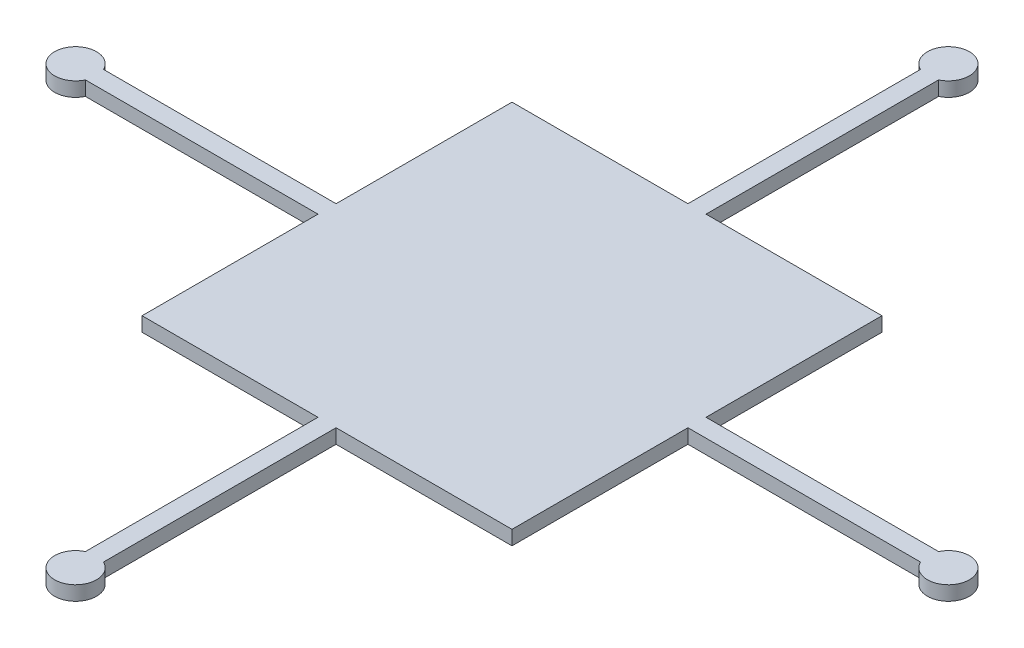
ISO-10303-21;
HEADER;
FILE_DESCRIPTION(('STEP AP214'),'2;1');
FILE_NAME('part.step','',(''),(''),'','','');
FILE_SCHEMA(('AUTOMOTIVE_DESIGN { 1 0 10303 214 1 1 1 1 }'));
ENDSEC;
DATA;
#1=APPLICATION_CONTEXT('core data for automotive mechanical design processes');
#2=APPLICATION_PROTOCOL_DEFINITION('international standard','automotive_design',2000,#1);
#3=PRODUCT_CONTEXT('',#1,'mechanical');
#4=PRODUCT('Part','Part','',(#3));
#5=PRODUCT_RELATED_PRODUCT_CATEGORY('part','',(#4));
#6=PRODUCT_DEFINITION_FORMATION('','',#4);
#7=PRODUCT_DEFINITION_CONTEXT('part definition',#1,'design');
#8=PRODUCT_DEFINITION('design','',#6,#7);
#9=PRODUCT_DEFINITION_SHAPE('','',#8);
#10=(LENGTH_UNIT() NAMED_UNIT(*) SI_UNIT(.MILLI.,.METRE.));
#11=(NAMED_UNIT(*) PLANE_ANGLE_UNIT() SI_UNIT($,.RADIAN.));
#12=(NAMED_UNIT(*) SI_UNIT($,.STERADIAN.) SOLID_ANGLE_UNIT());
#13=UNCERTAINTY_MEASURE_WITH_UNIT(LENGTH_MEASURE(1.E-05),#10,'distance_accuracy_value','');
#14=(GEOMETRIC_REPRESENTATION_CONTEXT(3) GLOBAL_UNCERTAINTY_ASSIGNED_CONTEXT((#13)) GLOBAL_UNIT_ASSIGNED_CONTEXT((#10,
#11,#12)) REPRESENTATION_CONTEXT('',''));
#15=CARTESIAN_POINT('',(0.,0.,0.));
#16=DIRECTION('',(0.,0.,1.));
#17=DIRECTION('',(1.,0.,0.));
#18=AXIS2_PLACEMENT_3D('',#15,#16,#17);
#19=CARTESIAN_POINT('',(0.,2.54,0.));
#20=DIRECTION('',(1.,0.,0.));
#21=DIRECTION('',(0.,0.,-1.));
#22=AXIS2_PLACEMENT_3D('',#19,#20,#21);
#23=PLANE('',#22);
#24=DIRECTION('',(0.,0.,1.));
#25=VECTOR('',#24,1.);
#26=CARTESIAN_POINT('',(0.,0.,0.));
#27=LINE('',#26,#25);
#28=CARTESIAN_POINT('',(0.,0.,-31.150096625763));
#29=VERTEX_POINT('',#28);
#30=CARTESIAN_POINT('',(0.,0.,0.));
#31=VERTEX_POINT('',#30);
#32=EDGE_CURVE('E201',#29,#31,#27,.T.);
#33=ORIENTED_EDGE('',*,*,#32,.T.);
#34=DIRECTION('',(0.,-1.,0.));
#35=VECTOR('',#34,1.);
#36=CARTESIAN_POINT('',(0.,2.54,0.));
#37=LINE('',#36,#35);
#38=CARTESIAN_POINT('',(0.,2.54,0.));
#39=VERTEX_POINT('',#38);
#40=EDGE_CURVE('E11',#39,#31,#37,.T.);
#41=ORIENTED_EDGE('',*,*,#40,.F.);
#42=DIRECTION('',(0.,0.,1.));
#43=VECTOR('',#42,1.);
#44=CARTESIAN_POINT('',(0.,2.54,0.));
#45=LINE('',#44,#43);
#46=CARTESIAN_POINT('',(0.,2.54,-31.150096625763));
#47=VERTEX_POINT('',#46);
#48=EDGE_CURVE('E239',#47,#39,#45,.T.);
#49=ORIENTED_EDGE('',*,*,#48,.F.);
#50=DIRECTION('',(0.,-1.,0.));
#51=VECTOR('',#50,1.);
#52=CARTESIAN_POINT('',(0.,2.54,-31.150096625763));
#53=LINE('',#52,#51);
#54=EDGE_CURVE('E197',#47,#29,#53,.T.);
#55=ORIENTED_EDGE('',*,*,#54,.T.);
#56=EDGE_LOOP('',(#33,#41,#49,#55));
#57=FACE_BOUND('',#56,.T.);
#58=ADVANCED_FACE('F33',(#57),#23,.F.);
#59=CARTESIAN_POINT('',(0.,2.54,0.));
#60=DIRECTION('',(0.,0.,-1.));
#61=DIRECTION('',(-1.,0.,0.));
#62=AXIS2_PLACEMENT_3D('',#59,#60,#61);
#63=PLANE('',#62);
#64=DIRECTION('',(1.,0.,0.));
#65=VECTOR('',#64,1.);
#66=CARTESIAN_POINT('',(0.,0.,0.));
#67=LINE('',#66,#65);
#68=CARTESIAN_POINT('',(31.150096625763,0.,0.));
#69=VERTEX_POINT('',#68);
#70=EDGE_CURVE('E204',#31,#69,#67,.T.);
#71=ORIENTED_EDGE('',*,*,#70,.T.);
#72=DIRECTION('',(0.,-1.,0.));
#73=VECTOR('',#72,1.);
#74=CARTESIAN_POINT('',(31.150096625763,2.54,0.));
#75=LINE('',#74,#73);
#76=CARTESIAN_POINT('',(31.150096625763,2.54,0.));
#77=VERTEX_POINT('',#76);
#78=EDGE_CURVE('E41',#77,#69,#75,.T.);
#79=ORIENTED_EDGE('',*,*,#78,.F.);
#80=DIRECTION('',(1.,0.,0.));
#81=VECTOR('',#80,1.);
#82=CARTESIAN_POINT('',(0.,2.54,0.));
#83=LINE('',#82,#81);
#84=EDGE_CURVE('E128',#39,#77,#83,.T.);
#85=ORIENTED_EDGE('',*,*,#84,.F.);
#86=ORIENTED_EDGE('',*,*,#40,.T.);
#87=EDGE_LOOP('',(#71,#79,#85,#86));
#88=FACE_BOUND('',#87,.T.);
#89=ADVANCED_FACE('F357',(#88),#63,.F.);
#90=CARTESIAN_POINT('',(31.150096625763,2.54,0.));
#91=DIRECTION('',(1.,0.,0.));
#92=DIRECTION('',(0.,0.,-1.));
#93=AXIS2_PLACEMENT_3D('',#90,#91,#92);
#94=PLANE('',#93);
#95=DIRECTION('',(0.,0.,1.));
#96=VECTOR('',#95,1.);
#97=CARTESIAN_POINT('',(31.150096625763,0.,0.));
#98=LINE('',#97,#96);
#99=CARTESIAN_POINT('',(31.150096625763,0.,41.1752629926275));
#100=VERTEX_POINT('',#99);
#101=EDGE_CURVE('E206',#69,#100,#98,.T.);
#102=ORIENTED_EDGE('',*,*,#101,.T.);
#103=DIRECTION('',(0.,-1.,0.));
#104=VECTOR('',#103,1.);
#105=CARTESIAN_POINT('',(31.150096625763,2.54,41.1752629926275));
#106=LINE('',#105,#104);
#107=CARTESIAN_POINT('',(31.150096625763,2.54,41.1752629926275));
#108=VERTEX_POINT('',#107);
#109=EDGE_CURVE('E282',#108,#100,#106,.T.);
#110=ORIENTED_EDGE('',*,*,#109,.F.);
#111=DIRECTION('',(0.,0.,1.));
#112=VECTOR('',#111,1.);
#113=CARTESIAN_POINT('',(31.150096625763,2.54,0.));
#114=LINE('',#113,#112);
#115=EDGE_CURVE('E290',#77,#108,#114,.T.);
#116=ORIENTED_EDGE('',*,*,#115,.F.);
#117=ORIENTED_EDGE('',*,*,#78,.T.);
#118=EDGE_LOOP('',(#102,#110,#116,#117));
#119=FACE_BOUND('',#118,.T.);
#120=ADVANCED_FACE('F288',(#119),#94,.F.);
#121=CARTESIAN_POINT('',(32.7530633605836,2.54,44.5210958705608));
#122=DIRECTION('',(0.,-1.,0.));
#123=DIRECTION('',(0.,0.,-1.));
#124=AXIS2_PLACEMENT_3D('',#121,#122,#123);
#125=CYLINDRICAL_SURFACE('',#124,3.71000000000006);
#126=CARTESIAN_POINT('',(32.7530633605836,0.,44.5210958705608));
#127=DIRECTION('',(0.,1.,0.));
#128=DIRECTION('',(0.,0.,1.));
#129=AXIS2_PLACEMENT_3D('',#126,#127,#128);
#130=CIRCLE('',#129,3.71000000000006);
#131=CARTESIAN_POINT('',(34.3560300954041,0.,41.1752629926275));
#132=VERTEX_POINT('',#131);
#133=EDGE_CURVE('E208',#100,#132,#130,.T.);
#134=ORIENTED_EDGE('',*,*,#133,.T.);
#135=DIRECTION('',(0.,-1.,0.));
#136=VECTOR('',#135,1.);
#137=CARTESIAN_POINT('',(34.3560300954041,2.54,41.1752629926275));
#138=LINE('',#137,#136);
#139=CARTESIAN_POINT('',(34.3560300954041,2.54,41.1752629926275));
#140=VERTEX_POINT('',#139);
#141=EDGE_CURVE('E279',#140,#132,#138,.T.);
#142=ORIENTED_EDGE('',*,*,#141,.F.);
#143=CARTESIAN_POINT('',(32.7530633605836,2.54,44.5210958705608));
#144=DIRECTION('',(0.,1.,0.));
#145=DIRECTION('',(0.,0.,1.));
#146=AXIS2_PLACEMENT_3D('',#143,#144,#145);
#147=CIRCLE('',#146,3.71000000000006);
#148=EDGE_CURVE('E308',#108,#140,#147,.T.);
#149=ORIENTED_EDGE('',*,*,#148,.F.);
#150=ORIENTED_EDGE('',*,*,#109,.T.);
#151=EDGE_LOOP('',(#134,#142,#149,#150));
#152=FACE_BOUND('',#151,.T.);
#153=ADVANCED_FACE('F299',(#152),#125,.T.);
#154=CARTESIAN_POINT('',(34.3560300954041,2.54,0.));
#155=DIRECTION('',(-1.,0.,0.));
#156=DIRECTION('',(0.,0.,1.));
#157=AXIS2_PLACEMENT_3D('',#154,#155,#156);
#158=PLANE('',#157);
#159=DIRECTION('',(0.,0.,-1.));
#160=VECTOR('',#159,1.);
#161=CARTESIAN_POINT('',(34.3560300954041,0.,0.));
#162=LINE('',#161,#160);
#163=CARTESIAN_POINT('',(34.3560300954041,0.,0.));
#164=VERTEX_POINT('',#163);
#165=EDGE_CURVE('E210',#132,#164,#162,.T.);
#166=ORIENTED_EDGE('',*,*,#165,.T.);
#167=DIRECTION('',(0.,-1.,0.));
#168=VECTOR('',#167,1.);
#169=CARTESIAN_POINT('',(34.3560300954041,2.54,0.));
#170=LINE('',#169,#168);
#171=CARTESIAN_POINT('',(34.3560300954041,2.54,0.));
#172=VERTEX_POINT('',#171);
#173=EDGE_CURVE('E276',#172,#164,#170,.T.);
#174=ORIENTED_EDGE('',*,*,#173,.F.);
#175=DIRECTION('',(0.,0.,-1.));
#176=VECTOR('',#175,1.);
#177=CARTESIAN_POINT('',(34.3560300954041,2.54,0.));
#178=LINE('',#177,#176);
#179=EDGE_CURVE('E305',#140,#172,#178,.T.);
#180=ORIENTED_EDGE('',*,*,#179,.F.);
#181=ORIENTED_EDGE('',*,*,#141,.T.);
#182=EDGE_LOOP('',(#166,#174,#180,#181));
#183=FACE_BOUND('',#182,.T.);
#184=ADVANCED_FACE('F303',(#183),#158,.F.);
#185=CARTESIAN_POINT('',(34.3560300954041,2.54,0.));
#186=DIRECTION('',(0.,0.,-1.));
#187=DIRECTION('',(-1.,0.,0.));
#188=AXIS2_PLACEMENT_3D('',#185,#186,#187);
#189=PLANE('',#188);
#190=DIRECTION('',(1.,0.,0.));
#191=VECTOR('',#190,1.);
#192=CARTESIAN_POINT('',(34.3560300954041,0.,0.));
#193=LINE('',#192,#191);
#194=CARTESIAN_POINT('',(65.5061267211671,0.,0.));
#195=VERTEX_POINT('',#194);
#196=EDGE_CURVE('E212',#164,#195,#193,.T.);
#197=ORIENTED_EDGE('',*,*,#196,.T.);
#198=DIRECTION('',(0.,-1.,0.));
#199=VECTOR('',#198,1.);
#200=CARTESIAN_POINT('',(65.5061267211671,2.54,0.));
#201=LINE('',#200,#199);
#202=CARTESIAN_POINT('',(65.5061267211671,2.54,0.));
#203=VERTEX_POINT('',#202);
#204=EDGE_CURVE('E273',#203,#195,#201,.T.);
#205=ORIENTED_EDGE('',*,*,#204,.F.);
#206=DIRECTION('',(1.,0.,0.));
#207=VECTOR('',#206,1.);
#208=CARTESIAN_POINT('',(34.3560300954041,2.54,0.));
#209=LINE('',#208,#207);
#210=EDGE_CURVE('E307',#172,#203,#209,.T.);
#211=ORIENTED_EDGE('',*,*,#210,.F.);
#212=ORIENTED_EDGE('',*,*,#173,.T.);
#213=EDGE_LOOP('',(#197,#205,#211,#212));
#214=FACE_BOUND('',#213,.T.);
#215=ADVANCED_FACE('F370',(#214),#189,.F.);
#216=CARTESIAN_POINT('',(65.5061267211671,2.54,0.));
#217=DIRECTION('',(-1.,0.,0.));
#218=DIRECTION('',(0.,0.,1.));
#219=AXIS2_PLACEMENT_3D('',#216,#217,#218);
#220=PLANE('',#219);
#221=DIRECTION('',(0.,0.,-1.));
#222=VECTOR('',#221,1.);
#223=CARTESIAN_POINT('',(65.5061267211671,0.,0.));
#224=LINE('',#223,#222);
#225=CARTESIAN_POINT('',(65.5061267211671,0.,-31.150096625763));
#226=VERTEX_POINT('',#225);
#227=EDGE_CURVE('E214',#195,#226,#224,.T.);
#228=ORIENTED_EDGE('',*,*,#227,.T.);
#229=DIRECTION('',(0.,-1.,0.));
#230=VECTOR('',#229,1.);
#231=CARTESIAN_POINT('',(65.5061267211671,2.54,-31.150096625763));
#232=LINE('',#231,#230);
#233=CARTESIAN_POINT('',(65.5061267211671,2.54,-31.150096625763));
#234=VERTEX_POINT('',#233);
#235=EDGE_CURVE('E270',#234,#226,#232,.T.);
#236=ORIENTED_EDGE('',*,*,#235,.F.);
#237=DIRECTION('',(0.,0.,-1.));
#238=VECTOR('',#237,1.);
#239=CARTESIAN_POINT('',(65.5061267211671,2.54,0.));
#240=LINE('',#239,#238);
#241=EDGE_CURVE('E310',#203,#234,#240,.T.);
#242=ORIENTED_EDGE('',*,*,#241,.F.);
#243=ORIENTED_EDGE('',*,*,#204,.T.);
#244=EDGE_LOOP('',(#228,#236,#242,#243));
#245=FACE_BOUND('',#244,.T.);
#246=ADVANCED_FACE('F373',(#245),#220,.F.);
#247=CARTESIAN_POINT('',(65.5061267211671,2.54,-31.150096625763));
#248=DIRECTION('',(0.,0.,-1.));
#249=DIRECTION('',(-1.,0.,0.));
#250=AXIS2_PLACEMENT_3D('',#247,#248,#249);
#251=PLANE('',#250);
#252=DIRECTION('',(1.,0.,0.));
#253=VECTOR('',#252,1.);
#254=CARTESIAN_POINT('',(65.5061267211671,0.,-31.150096625763));
#255=LINE('',#254,#253);
#256=CARTESIAN_POINT('',(106.681389713795,0.,-31.150096625763));
#257=VERTEX_POINT('',#256);
#258=EDGE_CURVE('E216',#226,#257,#255,.T.);
#259=ORIENTED_EDGE('',*,*,#258,.T.);
#260=DIRECTION('',(0.,-1.,0.));
#261=VECTOR('',#260,1.);
#262=CARTESIAN_POINT('',(106.681389713795,2.54,-31.150096625763));
#263=LINE('',#262,#261);
#264=CARTESIAN_POINT('',(106.681389713795,2.54,-31.150096625763));
#265=VERTEX_POINT('',#264);
#266=EDGE_CURVE('E267',#265,#257,#263,.T.);
#267=ORIENTED_EDGE('',*,*,#266,.F.);
#268=DIRECTION('',(1.,0.,0.));
#269=VECTOR('',#268,1.);
#270=CARTESIAN_POINT('',(65.5061267211671,2.54,-31.150096625763));
#271=LINE('',#270,#269);
#272=EDGE_CURVE('E316',#234,#265,#271,.T.);
#273=ORIENTED_EDGE('',*,*,#272,.F.);
#274=ORIENTED_EDGE('',*,*,#235,.T.);
#275=EDGE_LOOP('',(#259,#267,#273,#274));
#276=FACE_BOUND('',#275,.T.);
#277=ADVANCED_FACE('F377',(#276),#251,.F.);
#278=CARTESIAN_POINT('',(110.027222591728,2.54,-32.7530633605835));
#279=DIRECTION('',(0.,-1.,0.));
#280=DIRECTION('',(0.,0.,-1.));
#281=AXIS2_PLACEMENT_3D('',#278,#279,#280);
#282=CYLINDRICAL_SURFACE('',#281,3.7100000000001);
#283=CARTESIAN_POINT('',(110.027222591728,0.,-32.7530633605835));
#284=DIRECTION('',(0.,1.,0.));
#285=DIRECTION('',(0.,0.,-1.));
#286=AXIS2_PLACEMENT_3D('',#283,#284,#285);
#287=CIRCLE('',#286,3.7100000000001);
#288=CARTESIAN_POINT('',(106.681389713795,0.,-34.3560300954041));
#289=VERTEX_POINT('',#288);
#290=EDGE_CURVE('E218',#257,#289,#287,.T.);
#291=ORIENTED_EDGE('',*,*,#290,.T.);
#292=DIRECTION('',(0.,-1.,0.));
#293=VECTOR('',#292,1.);
#294=CARTESIAN_POINT('',(106.681389713795,2.54,-34.3560300954041));
#295=LINE('',#294,#293);
#296=CARTESIAN_POINT('',(106.681389713795,2.54,-34.3560300954041));
#297=VERTEX_POINT('',#296);
#298=EDGE_CURVE('E264',#297,#289,#295,.T.);
#299=ORIENTED_EDGE('',*,*,#298,.F.);
#300=CARTESIAN_POINT('',(110.027222591728,2.54,-32.7530633605835));
#301=DIRECTION('',(0.,1.,0.));
#302=DIRECTION('',(0.,0.,-1.));
#303=AXIS2_PLACEMENT_3D('',#300,#301,#302);
#304=CIRCLE('',#303,3.7100000000001);
#305=EDGE_CURVE('E318',#265,#297,#304,.T.);
#306=ORIENTED_EDGE('',*,*,#305,.F.);
#307=ORIENTED_EDGE('',*,*,#266,.T.);
#308=EDGE_LOOP('',(#291,#299,#306,#307));
#309=FACE_BOUND('',#308,.T.);
#310=ADVANCED_FACE('F381',(#309),#282,.T.);
#311=CARTESIAN_POINT('',(65.5061267211671,2.54,-34.3560300954041));
#312=DIRECTION('',(0.,0.,1.));
#313=DIRECTION('',(1.,0.,0.));
#314=AXIS2_PLACEMENT_3D('',#311,#312,#313);
#315=PLANE('',#314);
#316=DIRECTION('',(-1.,0.,0.));
#317=VECTOR('',#316,1.);
#318=CARTESIAN_POINT('',(65.5061267211671,0.,-34.3560300954041));
#319=LINE('',#318,#317);
#320=CARTESIAN_POINT('',(65.5061267211671,0.,-34.3560300954041));
#321=VERTEX_POINT('',#320);
#322=EDGE_CURVE('E220',#289,#321,#319,.T.);
#323=ORIENTED_EDGE('',*,*,#322,.T.);
#324=DIRECTION('',(0.,-1.,0.));
#325=VECTOR('',#324,1.);
#326=CARTESIAN_POINT('',(65.5061267211671,2.54,-34.3560300954041));
#327=LINE('',#326,#325);
#328=CARTESIAN_POINT('',(65.5061267211671,2.54,-34.3560300954041));
#329=VERTEX_POINT('',#328);
#330=EDGE_CURVE('E261',#329,#321,#327,.T.);
#331=ORIENTED_EDGE('',*,*,#330,.F.);
#332=DIRECTION('',(-1.,0.,0.));
#333=VECTOR('',#332,1.);
#334=CARTESIAN_POINT('',(65.5061267211671,2.54,-34.3560300954041));
#335=LINE('',#334,#333);
#336=EDGE_CURVE('E320',#297,#329,#335,.T.);
#337=ORIENTED_EDGE('',*,*,#336,.F.);
#338=ORIENTED_EDGE('',*,*,#298,.T.);
#339=EDGE_LOOP('',(#323,#331,#337,#338));
#340=FACE_BOUND('',#339,.T.);
#341=ADVANCED_FACE('F385',(#340),#315,.F.);
#342=CARTESIAN_POINT('',(65.5061267211671,2.54,-34.3560300954041));
#343=DIRECTION('',(-1.,0.,0.));
#344=DIRECTION('',(0.,0.,1.));
#345=AXIS2_PLACEMENT_3D('',#342,#343,#344);
#346=PLANE('',#345);
#347=DIRECTION('',(0.,0.,-1.));
#348=VECTOR('',#347,1.);
#349=CARTESIAN_POINT('',(65.5061267211671,0.,-34.3560300954041));
#350=LINE('',#349,#348);
#351=CARTESIAN_POINT('',(65.5061267211671,0.,-65.5061267211671));
#352=VERTEX_POINT('',#351);
#353=EDGE_CURVE('E222',#321,#352,#350,.T.);
#354=ORIENTED_EDGE('',*,*,#353,.T.);
#355=DIRECTION('',(0.,-1.,0.));
#356=VECTOR('',#355,1.);
#357=CARTESIAN_POINT('',(65.5061267211671,2.54,-65.5061267211671));
#358=LINE('',#357,#356);
#359=CARTESIAN_POINT('',(65.5061267211671,2.54,-65.5061267211671));
#360=VERTEX_POINT('',#359);
#361=EDGE_CURVE('E258',#360,#352,#358,.T.);
#362=ORIENTED_EDGE('',*,*,#361,.F.);
#363=DIRECTION('',(0.,0.,-1.));
#364=VECTOR('',#363,1.);
#365=CARTESIAN_POINT('',(65.5061267211671,2.54,-34.3560300954041));
#366=LINE('',#365,#364);
#367=EDGE_CURVE('E322',#329,#360,#366,.T.);
#368=ORIENTED_EDGE('',*,*,#367,.F.);
#369=ORIENTED_EDGE('',*,*,#330,.T.);
#370=EDGE_LOOP('',(#354,#362,#368,#369));
#371=FACE_BOUND('',#370,.T.);
#372=ADVANCED_FACE('F389',(#371),#346,.F.);
#373=CARTESIAN_POINT('',(34.3560300954041,2.54,-65.5061267211671));
#374=DIRECTION('',(0.,0.,1.));
#375=DIRECTION('',(1.,0.,0.));
#376=AXIS2_PLACEMENT_3D('',#373,#374,#375);
#377=PLANE('',#376);
#378=DIRECTION('',(-1.,0.,0.));
#379=VECTOR('',#378,1.);
#380=CARTESIAN_POINT('',(34.3560300954041,0.,-65.5061267211671));
#381=LINE('',#380,#379);
#382=CARTESIAN_POINT('',(34.3560300954041,0.,-65.5061267211671));
#383=VERTEX_POINT('',#382);
#384=EDGE_CURVE('E224',#352,#383,#381,.T.);
#385=ORIENTED_EDGE('',*,*,#384,.T.);
#386=DIRECTION('',(0.,-1.,0.));
#387=VECTOR('',#386,1.);
#388=CARTESIAN_POINT('',(34.3560300954041,2.54,-65.5061267211671));
#389=LINE('',#388,#387);
#390=CARTESIAN_POINT('',(34.3560300954041,2.54,-65.5061267211671));
#391=VERTEX_POINT('',#390);
#392=EDGE_CURVE('E255',#391,#383,#389,.T.);
#393=ORIENTED_EDGE('',*,*,#392,.F.);
#394=DIRECTION('',(-1.,0.,0.));
#395=VECTOR('',#394,1.);
#396=CARTESIAN_POINT('',(34.3560300954041,2.54,-65.5061267211671));
#397=LINE('',#396,#395);
#398=EDGE_CURVE('E324',#360,#391,#397,.T.);
#399=ORIENTED_EDGE('',*,*,#398,.F.);
#400=ORIENTED_EDGE('',*,*,#361,.T.);
#401=EDGE_LOOP('',(#385,#393,#399,#400));
#402=FACE_BOUND('',#401,.T.);
#403=ADVANCED_FACE('F393',(#402),#377,.F.);
#404=CARTESIAN_POINT('',(34.3560300954041,2.54,-65.5061267211671));
#405=DIRECTION('',(-1.,0.,0.));
#406=DIRECTION('',(0.,0.,1.));
#407=AXIS2_PLACEMENT_3D('',#404,#405,#406);
#408=PLANE('',#407);
#409=DIRECTION('',(0.,0.,-1.));
#410=VECTOR('',#409,1.);
#411=CARTESIAN_POINT('',(34.3560300954041,0.,-65.5061267211671));
#412=LINE('',#411,#410);
#413=CARTESIAN_POINT('',(34.3560300954041,0.,-106.681389713795));
#414=VERTEX_POINT('',#413);
#415=EDGE_CURVE('E226',#383,#414,#412,.T.);
#416=ORIENTED_EDGE('',*,*,#415,.T.);
#417=DIRECTION('',(0.,-1.,0.));
#418=VECTOR('',#417,1.);
#419=CARTESIAN_POINT('',(34.3560300954041,2.54,-106.681389713795));
#420=LINE('',#419,#418);
#421=CARTESIAN_POINT('',(34.3560300954041,2.54,-106.681389713795));
#422=VERTEX_POINT('',#421);
#423=EDGE_CURVE('E252',#422,#414,#420,.T.);
#424=ORIENTED_EDGE('',*,*,#423,.F.);
#425=DIRECTION('',(0.,0.,-1.));
#426=VECTOR('',#425,1.);
#427=CARTESIAN_POINT('',(34.3560300954041,2.54,-65.5061267211671));
#428=LINE('',#427,#426);
#429=EDGE_CURVE('E326',#391,#422,#428,.T.);
#430=ORIENTED_EDGE('',*,*,#429,.F.);
#431=ORIENTED_EDGE('',*,*,#392,.T.);
#432=EDGE_LOOP('',(#416,#424,#430,#431));
#433=FACE_BOUND('',#432,.T.);
#434=ADVANCED_FACE('F397',(#433),#408,.F.);
#435=CARTESIAN_POINT('',(32.7530633605836,2.54,-110.027222591728));
#436=DIRECTION('',(0.,-1.,0.));
#437=DIRECTION('',(0.,0.,-1.));
#438=AXIS2_PLACEMENT_3D('',#435,#436,#437);
#439=CYLINDRICAL_SURFACE('',#438,3.71000000000006);
#440=CARTESIAN_POINT('',(32.7530633605836,0.,-110.027222591728));
#441=DIRECTION('',(0.,1.,0.));
#442=DIRECTION('',(0.,0.,-1.));
#443=AXIS2_PLACEMENT_3D('',#440,#441,#442);
#444=CIRCLE('',#443,3.71000000000006);
#445=CARTESIAN_POINT('',(31.150096625763,0.,-106.681389713795));
#446=VERTEX_POINT('',#445);
#447=EDGE_CURVE('E228',#414,#446,#444,.T.);
#448=ORIENTED_EDGE('',*,*,#447,.T.);
#449=DIRECTION('',(0.,-1.,0.));
#450=VECTOR('',#449,1.);
#451=CARTESIAN_POINT('',(31.150096625763,2.54,-106.681389713795));
#452=LINE('',#451,#450);
#453=CARTESIAN_POINT('',(31.150096625763,2.54,-106.681389713795));
#454=VERTEX_POINT('',#453);
#455=EDGE_CURVE('E249',#454,#446,#452,.T.);
#456=ORIENTED_EDGE('',*,*,#455,.F.);
#457=CARTESIAN_POINT('',(32.7530633605836,2.54,-110.027222591728));
#458=DIRECTION('',(0.,1.,0.));
#459=DIRECTION('',(0.,0.,-1.));
#460=AXIS2_PLACEMENT_3D('',#457,#458,#459);
#461=CIRCLE('',#460,3.71000000000006);
#462=EDGE_CURVE('E328',#422,#454,#461,.T.);
#463=ORIENTED_EDGE('',*,*,#462,.F.);
#464=ORIENTED_EDGE('',*,*,#423,.T.);
#465=EDGE_LOOP('',(#448,#456,#463,#464));
#466=FACE_BOUND('',#465,.T.);
#467=ADVANCED_FACE('F401',(#466),#439,.T.);
#468=CARTESIAN_POINT('',(31.150096625763,2.54,-65.5061267211671));
#469=DIRECTION('',(1.,0.,0.));
#470=DIRECTION('',(0.,0.,-1.));
#471=AXIS2_PLACEMENT_3D('',#468,#469,#470);
#472=PLANE('',#471);
#473=DIRECTION('',(0.,0.,1.));
#474=VECTOR('',#473,1.);
#475=CARTESIAN_POINT('',(31.150096625763,0.,-65.5061267211671));
#476=LINE('',#475,#474);
#477=CARTESIAN_POINT('',(31.150096625763,0.,-65.5061267211671));
#478=VERTEX_POINT('',#477);
#479=EDGE_CURVE('E230',#446,#478,#476,.T.);
#480=ORIENTED_EDGE('',*,*,#479,.T.);
#481=DIRECTION('',(0.,-1.,0.));
#482=VECTOR('',#481,1.);
#483=CARTESIAN_POINT('',(31.150096625763,2.54,-65.5061267211671));
#484=LINE('',#483,#482);
#485=CARTESIAN_POINT('',(31.150096625763,2.54,-65.5061267211671));
#486=VERTEX_POINT('',#485);
#487=EDGE_CURVE('E246',#486,#478,#484,.T.);
#488=ORIENTED_EDGE('',*,*,#487,.F.);
#489=DIRECTION('',(0.,0.,1.));
#490=VECTOR('',#489,1.);
#491=CARTESIAN_POINT('',(31.150096625763,2.54,-65.5061267211671));
#492=LINE('',#491,#490);
#493=EDGE_CURVE('E330',#454,#486,#492,.T.);
#494=ORIENTED_EDGE('',*,*,#493,.F.);
#495=ORIENTED_EDGE('',*,*,#455,.T.);
#496=EDGE_LOOP('',(#480,#488,#494,#495));
#497=FACE_BOUND('',#496,.T.);
#498=ADVANCED_FACE('F405',(#497),#472,.F.);
#499=CARTESIAN_POINT('',(0.,2.54,-65.5061267211671));
#500=DIRECTION('',(0.,0.,1.));
#501=DIRECTION('',(1.,0.,0.));
#502=AXIS2_PLACEMENT_3D('',#499,#500,#501);
#503=PLANE('',#502);
#504=DIRECTION('',(-1.,0.,0.));
#505=VECTOR('',#504,1.);
#506=CARTESIAN_POINT('',(0.,0.,-65.5061267211671));
#507=LINE('',#506,#505);
#508=CARTESIAN_POINT('',(0.,0.,-65.5061267211671));
#509=VERTEX_POINT('',#508);
#510=EDGE_CURVE('E232',#478,#509,#507,.T.);
#511=ORIENTED_EDGE('',*,*,#510,.T.);
#512=DIRECTION('',(0.,-1.,0.));
#513=VECTOR('',#512,1.);
#514=CARTESIAN_POINT('',(0.,2.54,-65.5061267211671));
#515=LINE('',#514,#513);
#516=CARTESIAN_POINT('',(0.,2.54,-65.5061267211671));
#517=VERTEX_POINT('',#516);
#518=EDGE_CURVE('E243',#517,#509,#515,.T.);
#519=ORIENTED_EDGE('',*,*,#518,.F.);
#520=DIRECTION('',(-1.,0.,0.));
#521=VECTOR('',#520,1.);
#522=CARTESIAN_POINT('',(0.,2.54,-65.5061267211671));
#523=LINE('',#522,#521);
#524=EDGE_CURVE('E332',#486,#517,#523,.T.);
#525=ORIENTED_EDGE('',*,*,#524,.F.);
#526=ORIENTED_EDGE('',*,*,#487,.T.);
#527=EDGE_LOOP('',(#511,#519,#525,#526));
#528=FACE_BOUND('',#527,.T.);
#529=ADVANCED_FACE('F338',(#528),#503,.F.);
#530=CARTESIAN_POINT('',(0.,2.54,-34.3560300954041));
#531=DIRECTION('',(1.,0.,0.));
#532=DIRECTION('',(0.,0.,-1.));
#533=AXIS2_PLACEMENT_3D('',#530,#531,#532);
#534=PLANE('',#533);
#535=DIRECTION('',(0.,0.,1.));
#536=VECTOR('',#535,1.);
#537=CARTESIAN_POINT('',(0.,0.,-34.3560300954041));
#538=LINE('',#537,#536);
#539=CARTESIAN_POINT('',(0.,0.,-34.3560300954041));
#540=VERTEX_POINT('',#539);
#541=EDGE_CURVE('E234',#509,#540,#538,.T.);
#542=ORIENTED_EDGE('',*,*,#541,.T.);
#543=DIRECTION('',(0.,-1.,0.));
#544=VECTOR('',#543,1.);
#545=CARTESIAN_POINT('',(0.,2.54,-34.3560300954041));
#546=LINE('',#545,#544);
#547=CARTESIAN_POINT('',(0.,2.54,-34.3560300954041));
#548=VERTEX_POINT('',#547);
#549=EDGE_CURVE('E192',#548,#540,#546,.T.);
#550=ORIENTED_EDGE('',*,*,#549,.F.);
#551=DIRECTION('',(0.,0.,1.));
#552=VECTOR('',#551,1.);
#553=CARTESIAN_POINT('',(0.,2.54,-34.3560300954041));
#554=LINE('',#553,#552);
#555=EDGE_CURVE('E183',#517,#548,#554,.T.);
#556=ORIENTED_EDGE('',*,*,#555,.F.);
#557=ORIENTED_EDGE('',*,*,#518,.T.);
#558=EDGE_LOOP('',(#542,#550,#556,#557));
#559=FACE_BOUND('',#558,.T.);
#560=ADVANCED_FACE('F342',(#559),#534,.F.);
#561=CARTESIAN_POINT('',(0.,2.54,-34.3560300954041));
#562=DIRECTION('',(0.,0.,1.));
#563=DIRECTION('',(1.,0.,0.));
#564=AXIS2_PLACEMENT_3D('',#561,#562,#563);
#565=PLANE('',#564);
#566=DIRECTION('',(-1.,0.,0.));
#567=VECTOR('',#566,1.);
#568=CARTESIAN_POINT('',(0.,0.,-34.3560300954041));
#569=LINE('',#568,#567);
#570=CARTESIAN_POINT('',(-41.1752629926276,0.,-34.3560300954042));
#571=VERTEX_POINT('',#570);
#572=EDGE_CURVE('E191',#540,#571,#569,.T.);
#573=ORIENTED_EDGE('',*,*,#572,.T.);
#574=DIRECTION('',(0.,-1.,0.));
#575=VECTOR('',#574,1.);
#576=CARTESIAN_POINT('',(-41.1752629926276,2.54,-34.3560300954042));
#577=LINE('',#576,#575);
#578=CARTESIAN_POINT('',(-41.1752629926276,2.54,-34.3560300954042));
#579=VERTEX_POINT('',#578);
#580=EDGE_CURVE('E188',#579,#571,#577,.T.);
#581=ORIENTED_EDGE('',*,*,#580,.F.);
#582=DIRECTION('',(-1.,0.,0.));
#583=VECTOR('',#582,1.);
#584=CARTESIAN_POINT('',(0.,2.54,-34.3560300954041));
#585=LINE('',#584,#583);
#586=EDGE_CURVE('E177',#548,#579,#585,.T.);
#587=ORIENTED_EDGE('',*,*,#586,.F.);
#588=ORIENTED_EDGE('',*,*,#549,.T.);
#589=EDGE_LOOP('',(#573,#581,#587,#588));
#590=FACE_BOUND('',#589,.T.);
#591=ADVANCED_FACE('F189',(#590),#565,.F.);
#592=CARTESIAN_POINT('',(-44.5210958705608,2.54,-32.7530633605836));
#593=DIRECTION('',(0.,-1.,0.));
#594=DIRECTION('',(0.,0.,-1.));
#595=AXIS2_PLACEMENT_3D('',#592,#593,#594);
#596=CYLINDRICAL_SURFACE('',#595,3.71000000000006);
#597=CARTESIAN_POINT('',(-44.5210958705608,0.,-32.7530633605836));
#598=DIRECTION('',(0.,1.,0.));
#599=DIRECTION('',(0.,0.,1.));
#600=AXIS2_PLACEMENT_3D('',#597,#598,#599);
#601=CIRCLE('',#600,3.71000000000006);
#602=CARTESIAN_POINT('',(-41.1752629926276,0.,-31.150096625763));
#603=VERTEX_POINT('',#602);
#604=EDGE_CURVE('E114',#571,#603,#601,.T.);
#605=ORIENTED_EDGE('',*,*,#604,.T.);
#606=DIRECTION('',(0.,-1.,0.));
#607=VECTOR('',#606,1.);
#608=CARTESIAN_POINT('',(-41.1752629926276,2.54,-31.150096625763));
#609=LINE('',#608,#607);
#610=CARTESIAN_POINT('',(-41.1752629926276,2.54,-31.150096625763));
#611=VERTEX_POINT('',#610);
#612=EDGE_CURVE('E193',#611,#603,#609,.T.);
#613=ORIENTED_EDGE('',*,*,#612,.F.);
#614=CARTESIAN_POINT('',(-44.5210958705608,2.54,-32.7530633605836));
#615=DIRECTION('',(0.,1.,0.));
#616=DIRECTION('',(0.,0.,1.));
#617=AXIS2_PLACEMENT_3D('',#614,#615,#616);
#618=CIRCLE('',#617,3.71000000000006);
#619=EDGE_CURVE('E181',#579,#611,#618,.T.);
#620=ORIENTED_EDGE('',*,*,#619,.F.);
#621=ORIENTED_EDGE('',*,*,#580,.T.);
#622=EDGE_LOOP('',(#605,#613,#620,#621));
#623=FACE_BOUND('',#622,.T.);
#624=ADVANCED_FACE('F195',(#623),#596,.T.);
#625=CARTESIAN_POINT('',(0.,2.54,-31.150096625763));
#626=DIRECTION('',(0.,0.,-1.));
#627=DIRECTION('',(-1.,0.,0.));
#628=AXIS2_PLACEMENT_3D('',#625,#626,#627);
#629=PLANE('',#628);
#630=DIRECTION('',(1.,0.,0.));
#631=VECTOR('',#630,1.);
#632=CARTESIAN_POINT('',(0.,0.,-31.150096625763));
#633=LINE('',#632,#631);
#634=EDGE_CURVE('E120',#603,#29,#633,.T.);
#635=ORIENTED_EDGE('',*,*,#634,.T.);
#636=ORIENTED_EDGE('',*,*,#54,.F.);
#637=DIRECTION('',(1.,0.,0.));
#638=VECTOR('',#637,1.);
#639=CARTESIAN_POINT('',(0.,2.54,-31.150096625763));
#640=LINE('',#639,#638);
#641=EDGE_CURVE('E49',#611,#47,#640,.T.);
#642=ORIENTED_EDGE('',*,*,#641,.F.);
#643=ORIENTED_EDGE('',*,*,#612,.T.);
#644=EDGE_LOOP('',(#635,#636,#642,#643));
#645=FACE_BOUND('',#644,.T.);
#646=ADVANCED_FACE('F346',(#645),#629,.F.);
#647=CARTESIAN_POINT('',(-44.5210958705608,2.54,-32.7530633605836));
#648=DIRECTION('',(0.,1.,0.));
#649=DIRECTION('',(0.,0.,1.));
#650=AXIS2_PLACEMENT_3D('',#647,#648,#649);
#651=PLANE('',#650);
#652=ORIENTED_EDGE('',*,*,#48,.T.);
#653=ORIENTED_EDGE('',*,*,#84,.T.);
#654=ORIENTED_EDGE('',*,*,#115,.T.);
#655=ORIENTED_EDGE('',*,*,#148,.T.);
#656=ORIENTED_EDGE('',*,*,#179,.T.);
#657=ORIENTED_EDGE('',*,*,#210,.T.);
#658=ORIENTED_EDGE('',*,*,#241,.T.);
#659=ORIENTED_EDGE('',*,*,#272,.T.);
#660=ORIENTED_EDGE('',*,*,#305,.T.);
#661=ORIENTED_EDGE('',*,*,#336,.T.);
#662=ORIENTED_EDGE('',*,*,#367,.T.);
#663=ORIENTED_EDGE('',*,*,#398,.T.);
#664=ORIENTED_EDGE('',*,*,#429,.T.);
#665=ORIENTED_EDGE('',*,*,#462,.T.);
#666=ORIENTED_EDGE('',*,*,#493,.T.);
#667=ORIENTED_EDGE('',*,*,#524,.T.);
#668=ORIENTED_EDGE('',*,*,#555,.T.);
#669=ORIENTED_EDGE('',*,*,#586,.T.);
#670=ORIENTED_EDGE('',*,*,#619,.T.);
#671=ORIENTED_EDGE('',*,*,#641,.T.);
#672=EDGE_LOOP('',(#652,#653,#654,#655,#656,#657,#658,#659,#660,#661,#662,#663,#664,#665,#666,
#667,#668,#669,#670,#671));
#673=FACE_BOUND('',#672,.T.);
#674=ADVANCED_FACE('F179',(#673),#651,.T.);
#675=CARTESIAN_POINT('',(-44.5210958705608,0.,-32.7530633605836));
#676=DIRECTION('',(0.,1.,0.));
#677=DIRECTION('',(0.,0.,1.));
#678=AXIS2_PLACEMENT_3D('',#675,#676,#677);
#679=PLANE('',#678);
#680=ORIENTED_EDGE('',*,*,#32,.F.);
#681=ORIENTED_EDGE('',*,*,#634,.F.);
#682=ORIENTED_EDGE('',*,*,#604,.F.);
#683=ORIENTED_EDGE('',*,*,#572,.F.);
#684=ORIENTED_EDGE('',*,*,#541,.F.);
#685=ORIENTED_EDGE('',*,*,#510,.F.);
#686=ORIENTED_EDGE('',*,*,#479,.F.);
#687=ORIENTED_EDGE('',*,*,#447,.F.);
#688=ORIENTED_EDGE('',*,*,#415,.F.);
#689=ORIENTED_EDGE('',*,*,#384,.F.);
#690=ORIENTED_EDGE('',*,*,#353,.F.);
#691=ORIENTED_EDGE('',*,*,#322,.F.);
#692=ORIENTED_EDGE('',*,*,#290,.F.);
#693=ORIENTED_EDGE('',*,*,#258,.F.);
#694=ORIENTED_EDGE('',*,*,#227,.F.);
#695=ORIENTED_EDGE('',*,*,#196,.F.);
#696=ORIENTED_EDGE('',*,*,#165,.F.);
#697=ORIENTED_EDGE('',*,*,#133,.F.);
#698=ORIENTED_EDGE('',*,*,#101,.F.);
#699=ORIENTED_EDGE('',*,*,#70,.F.);
#700=EDGE_LOOP('',(#680,#681,#682,#683,#684,#685,#686,#687,#688,#689,#690,#691,#692,#693,#694,
#695,#696,#697,#698,#699));
#701=FACE_BOUND('',#700,.T.);
#702=ADVANCED_FACE('F294',(#701),#679,.F.);
#703=CLOSED_SHELL('',(#58,#89,#120,#153,#184,#215,#246,#277,#310,#341,#372,#403,#434,#467,#498,
#529,#560,#591,#624,#646,#674,#702));
#704=MANIFOLD_SOLID_BREP('B2',#703);
#705=ADVANCED_BREP_SHAPE_REPRESENTATION('',(#18,#704),#14);
#706=SHAPE_DEFINITION_REPRESENTATION(#9,#705);
ENDSEC;
END-ISO-10303-21;
